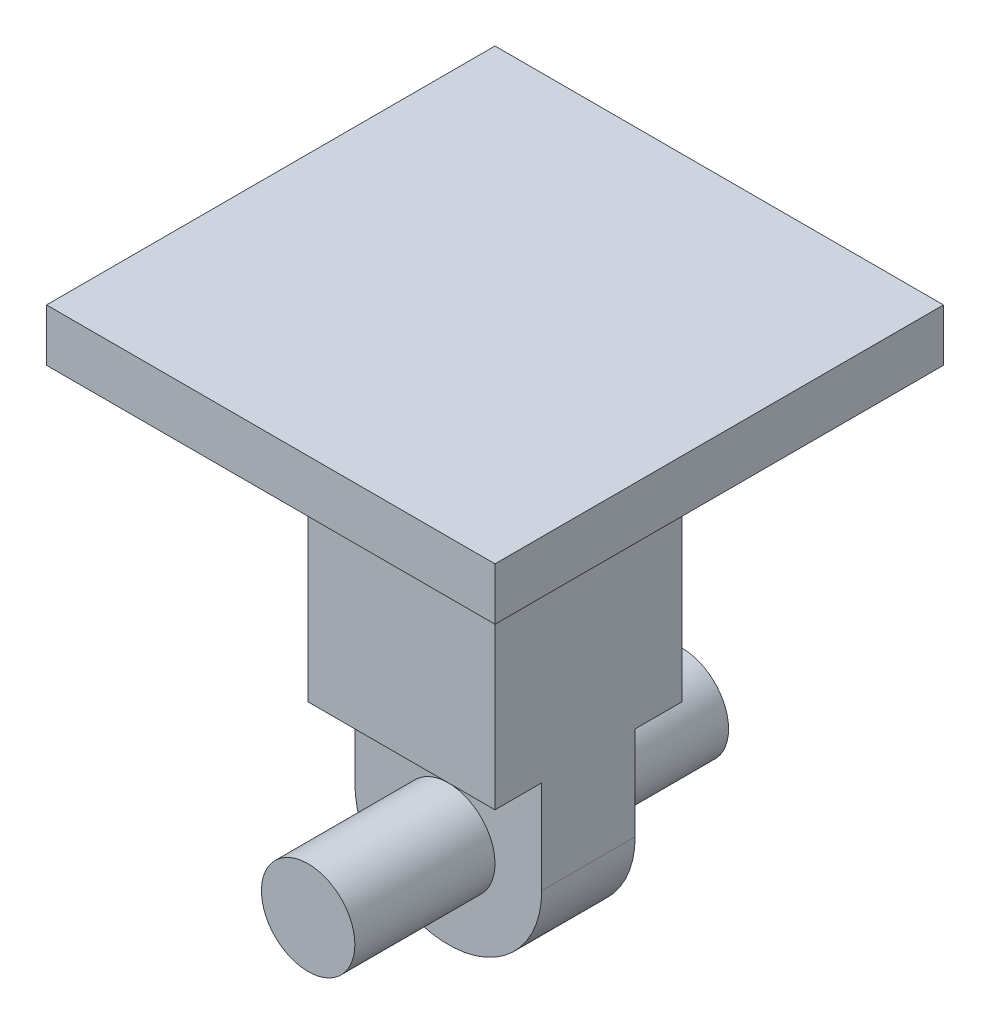
ISO-10303-21;
HEADER;
FILE_DESCRIPTION(('STEP AP214'),'2;1');
FILE_NAME('part.step','',(''),(''),'','','');
FILE_SCHEMA(('AUTOMOTIVE_DESIGN { 1 0 10303 214 1 1 1 1 }'));
ENDSEC;
DATA;
#1=APPLICATION_CONTEXT('core data for automotive mechanical design processes');
#2=APPLICATION_PROTOCOL_DEFINITION('international standard','automotive_design',2000,#1);
#3=PRODUCT_CONTEXT('',#1,'mechanical');
#4=PRODUCT('Part','Part','',(#3));
#5=PRODUCT_RELATED_PRODUCT_CATEGORY('part','',(#4));
#6=PRODUCT_DEFINITION_FORMATION('','',#4);
#7=PRODUCT_DEFINITION_CONTEXT('part definition',#1,'design');
#8=PRODUCT_DEFINITION('design','',#6,#7);
#9=PRODUCT_DEFINITION_SHAPE('','',#8);
#10=(LENGTH_UNIT() NAMED_UNIT(*) SI_UNIT(.MILLI.,.METRE.));
#11=(NAMED_UNIT(*) PLANE_ANGLE_UNIT() SI_UNIT($,.RADIAN.));
#12=(NAMED_UNIT(*) SI_UNIT($,.STERADIAN.) SOLID_ANGLE_UNIT());
#13=UNCERTAINTY_MEASURE_WITH_UNIT(LENGTH_MEASURE(1.E-05),#10,'distance_accuracy_value','');
#14=(GEOMETRIC_REPRESENTATION_CONTEXT(3) GLOBAL_UNCERTAINTY_ASSIGNED_CONTEXT((#13)) GLOBAL_UNIT_ASSIGNED_CONTEXT((#10,
#11,#12)) REPRESENTATION_CONTEXT('',''));
#15=CARTESIAN_POINT('',(0.,0.,0.));
#16=DIRECTION('',(0.,0.,1.));
#17=DIRECTION('',(1.,0.,0.));
#18=AXIS2_PLACEMENT_3D('',#15,#16,#17);
#19=CARTESIAN_POINT('',(12.5,-51.5,12.5));
#20=DIRECTION('',(1.,0.,0.));
#21=DIRECTION('',(0.,0.,-1.));
#22=AXIS2_PLACEMENT_3D('',#19,#20,#21);
#23=PLANE('',#22);
#24=DIRECTION('',(0.,0.,-1.));
#25=VECTOR('',#24,1.);
#26=CARTESIAN_POINT('',(12.5,-39.,12.5));
#27=LINE('',#26,#25);
#28=CARTESIAN_POINT('',(12.5,-39.,12.5));
#29=VERTEX_POINT('',#28);
#30=CARTESIAN_POINT('',(12.5,-39.,6.25));
#31=VERTEX_POINT('',#30);
#32=EDGE_CURVE('E129',#29,#31,#27,.T.);
#33=ORIENTED_EDGE('',*,*,#32,.T.);
#34=DIRECTION('',(0.,-1.,0.));
#35=VECTOR('',#34,1.);
#36=CARTESIAN_POINT('',(12.5,-39.,6.25));
#37=LINE('',#36,#35);
#38=CARTESIAN_POINT('',(12.5,-51.5,6.25));
#39=VERTEX_POINT('',#38);
#40=EDGE_CURVE('E197',#31,#39,#37,.T.);
#41=ORIENTED_EDGE('',*,*,#40,.T.);
#42=DIRECTION('',(0.,0.,-1.));
#43=VECTOR('',#42,1.);
#44=CARTESIAN_POINT('',(12.5,-51.5,12.5));
#45=LINE('',#44,#43);
#46=CARTESIAN_POINT('',(12.5,-51.5,-6.25000000000001));
#47=VERTEX_POINT('',#46);
#48=EDGE_CURVE('E191',#39,#47,#45,.T.);
#49=ORIENTED_EDGE('',*,*,#48,.T.);
#50=DIRECTION('',(0.,-1.,0.));
#51=VECTOR('',#50,1.);
#52=CARTESIAN_POINT('',(12.5,-39.,-6.25));
#53=LINE('',#52,#51);
#54=CARTESIAN_POINT('',(12.5,-39.,-6.25));
#55=VERTEX_POINT('',#54);
#56=EDGE_CURVE('E50',#55,#47,#53,.T.);
#57=ORIENTED_EDGE('',*,*,#56,.F.);
#58=DIRECTION('',(0.,0.,-1.));
#59=VECTOR('',#58,1.);
#60=CARTESIAN_POINT('',(12.5,-39.,-12.5));
#61=LINE('',#60,#59);
#62=CARTESIAN_POINT('',(12.5,-39.,-12.5));
#63=VERTEX_POINT('',#62);
#64=EDGE_CURVE('E223',#55,#63,#61,.T.);
#65=ORIENTED_EDGE('',*,*,#64,.T.);
#66=DIRECTION('',(0.,1.,0.));
#67=VECTOR('',#66,1.);
#68=CARTESIAN_POINT('',(12.5,-51.5,-12.5));
#69=LINE('',#68,#67);
#70=CARTESIAN_POINT('',(12.5,0.,-12.5));
#71=VERTEX_POINT('',#70);
#72=EDGE_CURVE('E151',#63,#71,#69,.T.);
#73=ORIENTED_EDGE('',*,*,#72,.T.);
#74=DIRECTION('',(0.,0.,-1.));
#75=VECTOR('',#74,1.);
#76=CARTESIAN_POINT('',(12.5,0.,12.5));
#77=LINE('',#76,#75);
#78=CARTESIAN_POINT('',(12.5,0.,12.5));
#79=VERTEX_POINT('',#78);
#80=EDGE_CURVE('E204',#79,#71,#77,.T.);
#81=ORIENTED_EDGE('',*,*,#80,.F.);
#82=DIRECTION('',(0.,1.,0.));
#83=VECTOR('',#82,1.);
#84=CARTESIAN_POINT('',(12.5,-51.5,12.5));
#85=LINE('',#84,#83);
#86=EDGE_CURVE('E146',#29,#79,#85,.T.);
#87=ORIENTED_EDGE('',*,*,#86,.F.);
#88=EDGE_LOOP('',(#33,#41,#49,#57,#65,#73,#81,#87));
#89=FACE_BOUND('',#88,.T.);
#90=ADVANCED_FACE('F34',(#89),#23,.T.);
#91=CARTESIAN_POINT('',(-12.5,-51.5,12.5));
#92=DIRECTION('',(0.,0.,1.));
#93=DIRECTION('',(1.,0.,0.));
#94=AXIS2_PLACEMENT_3D('',#91,#92,#93);
#95=PLANE('',#94);
#96=DIRECTION('',(0.,1.,0.));
#97=VECTOR('',#96,1.);
#98=CARTESIAN_POINT('',(-12.5,-51.5,12.5));
#99=LINE('',#98,#97);
#100=CARTESIAN_POINT('',(-12.5,-39.,12.5));
#101=VERTEX_POINT('',#100);
#102=CARTESIAN_POINT('',(-12.5,0.,12.5));
#103=VERTEX_POINT('',#102);
#104=EDGE_CURVE('E138',#101,#103,#99,.T.);
#105=ORIENTED_EDGE('',*,*,#104,.F.);
#106=DIRECTION('',(1.,0.,0.));
#107=VECTOR('',#106,1.);
#108=CARTESIAN_POINT('',(-12.5,-39.,12.5));
#109=LINE('',#108,#107);
#110=EDGE_CURVE('E123',#101,#29,#109,.T.);
#111=ORIENTED_EDGE('',*,*,#110,.T.);
#112=ORIENTED_EDGE('',*,*,#86,.T.);
#113=DIRECTION('',(1.,0.,0.));
#114=VECTOR('',#113,1.);
#115=CARTESIAN_POINT('',(-12.5,0.,12.5));
#116=LINE('',#115,#114);
#117=EDGE_CURVE('E144',#103,#79,#116,.T.);
#118=ORIENTED_EDGE('',*,*,#117,.F.);
#119=EDGE_LOOP('',(#105,#111,#112,#118));
#120=FACE_BOUND('',#119,.T.);
#121=ADVANCED_FACE('F142',(#120),#95,.T.);
#122=CARTESIAN_POINT('',(-12.5,-51.5,12.5));
#123=DIRECTION('',(-1.,0.,0.));
#124=DIRECTION('',(0.,0.,1.));
#125=AXIS2_PLACEMENT_3D('',#122,#123,#124);
#126=PLANE('',#125);
#127=DIRECTION('',(0.,0.,1.));
#128=VECTOR('',#127,1.);
#129=CARTESIAN_POINT('',(-12.5,-51.5,12.5));
#130=LINE('',#129,#128);
#131=CARTESIAN_POINT('',(-12.5,-51.5,-6.25));
#132=VERTEX_POINT('',#131);
#133=CARTESIAN_POINT('',(-12.5,-51.5,6.25));
#134=VERTEX_POINT('',#133);
#135=EDGE_CURVE('E156',#132,#134,#130,.T.);
#136=ORIENTED_EDGE('',*,*,#135,.T.);
#137=DIRECTION('',(0.,-1.,0.));
#138=VECTOR('',#137,1.);
#139=CARTESIAN_POINT('',(-12.5,-39.,6.25));
#140=LINE('',#139,#138);
#141=CARTESIAN_POINT('',(-12.5,-39.,6.25));
#142=VERTEX_POINT('',#141);
#143=EDGE_CURVE('E58',#142,#134,#140,.T.);
#144=ORIENTED_EDGE('',*,*,#143,.F.);
#145=DIRECTION('',(0.,0.,1.));
#146=VECTOR('',#145,1.);
#147=CARTESIAN_POINT('',(-12.5,-39.,12.5));
#148=LINE('',#147,#146);
#149=EDGE_CURVE('E127',#142,#101,#148,.T.);
#150=ORIENTED_EDGE('',*,*,#149,.T.);
#151=ORIENTED_EDGE('',*,*,#104,.T.);
#152=DIRECTION('',(0.,0.,1.));
#153=VECTOR('',#152,1.);
#154=CARTESIAN_POINT('',(-12.5,0.,12.5));
#155=LINE('',#154,#153);
#156=CARTESIAN_POINT('',(-12.5,0.,-12.5));
#157=VERTEX_POINT('',#156);
#158=EDGE_CURVE('E200',#157,#103,#155,.T.);
#159=ORIENTED_EDGE('',*,*,#158,.F.);
#160=DIRECTION('',(0.,1.,0.));
#161=VECTOR('',#160,1.);
#162=CARTESIAN_POINT('',(-12.5,-51.5,-12.5));
#163=LINE('',#162,#161);
#164=CARTESIAN_POINT('',(-12.5,-39.,-12.5));
#165=VERTEX_POINT('',#164);
#166=EDGE_CURVE('E147',#165,#157,#163,.T.);
#167=ORIENTED_EDGE('',*,*,#166,.F.);
#168=DIRECTION('',(0.,0.,1.));
#169=VECTOR('',#168,1.);
#170=CARTESIAN_POINT('',(-12.5,-39.,-12.5));
#171=LINE('',#170,#169);
#172=CARTESIAN_POINT('',(-12.5,-39.,-6.25));
#173=VERTEX_POINT('',#172);
#174=EDGE_CURVE('E215',#165,#173,#171,.T.);
#175=ORIENTED_EDGE('',*,*,#174,.T.);
#176=DIRECTION('',(0.,-1.,0.));
#177=VECTOR('',#176,1.);
#178=CARTESIAN_POINT('',(-12.5,-39.,-6.25));
#179=LINE('',#178,#177);
#180=EDGE_CURVE('E140',#173,#132,#179,.T.);
#181=ORIENTED_EDGE('',*,*,#180,.T.);
#182=EDGE_LOOP('',(#136,#144,#150,#151,#159,#167,#175,#181));
#183=FACE_BOUND('',#182,.T.);
#184=ADVANCED_FACE('F136',(#183),#126,.T.);
#185=CARTESIAN_POINT('',(0.,-51.5,-40.4508497187474));
#186=DIRECTION('',(0.,0.,1.));
#187=DIRECTION('',(1.,0.,0.));
#188=AXIS2_PLACEMENT_3D('',#185,#186,#187);
#189=CYLINDRICAL_SURFACE('',#188,12.5);
#190=ORIENTED_EDGE('',*,*,#48,.F.);
#191=CARTESIAN_POINT('',(0.,-51.5,6.25));
#192=DIRECTION('',(0.,0.,1.));
#193=DIRECTION('',(1.,0.,0.));
#194=AXIS2_PLACEMENT_3D('',#191,#192,#193);
#195=CIRCLE('',#194,12.5);
#196=EDGE_CURVE('E11',#39,#134,#195,.F.);
#197=ORIENTED_EDGE('',*,*,#196,.T.);
#198=ORIENTED_EDGE('',*,*,#135,.F.);
#199=CARTESIAN_POINT('',(0.,-51.5,-6.25));
#200=DIRECTION('',(0.,0.,-1.));
#201=DIRECTION('',(-1.,0.,0.));
#202=AXIS2_PLACEMENT_3D('',#199,#200,#201);
#203=CIRCLE('',#202,12.5);
#204=EDGE_CURVE('E43',#132,#47,#203,.F.);
#205=ORIENTED_EDGE('',*,*,#204,.T.);
#206=EDGE_LOOP('',(#190,#197,#198,#205));
#207=FACE_BOUND('',#206,.T.);
#208=ADVANCED_FACE('F190',(#207),#189,.T.);
#209=CARTESIAN_POINT('',(0.,0.,0.));
#210=DIRECTION('',(0.,-1.,0.));
#211=DIRECTION('',(0.,0.,-1.));
#212=AXIS2_PLACEMENT_3D('',#209,#210,#211);
#213=PLANE('',#212);
#214=DIRECTION('',(0.,0.,-1.));
#215=VECTOR('',#214,1.);
#216=CARTESIAN_POINT('',(30.,0.,30.));
#217=LINE('',#216,#215);
#218=CARTESIAN_POINT('',(30.,0.,30.));
#219=VERTEX_POINT('',#218);
#220=CARTESIAN_POINT('',(30.,0.,-30.));
#221=VERTEX_POINT('',#220);
#222=EDGE_CURVE('E149',#219,#221,#217,.T.);
#223=ORIENTED_EDGE('',*,*,#222,.F.);
#224=DIRECTION('',(1.,0.,0.));
#225=VECTOR('',#224,1.);
#226=CARTESIAN_POINT('',(-30.,0.,30.));
#227=LINE('',#226,#225);
#228=CARTESIAN_POINT('',(-30.,0.,30.));
#229=VERTEX_POINT('',#228);
#230=EDGE_CURVE('E161',#229,#219,#227,.T.);
#231=ORIENTED_EDGE('',*,*,#230,.F.);
#232=DIRECTION('',(0.,0.,1.));
#233=VECTOR('',#232,1.);
#234=CARTESIAN_POINT('',(-30.,0.,30.));
#235=LINE('',#234,#233);
#236=CARTESIAN_POINT('',(-30.,0.,-30.));
#237=VERTEX_POINT('',#236);
#238=EDGE_CURVE('E172',#237,#229,#235,.T.);
#239=ORIENTED_EDGE('',*,*,#238,.F.);
#240=DIRECTION('',(-1.,0.,0.));
#241=VECTOR('',#240,1.);
#242=CARTESIAN_POINT('',(-30.,0.,-30.));
#243=LINE('',#242,#241);
#244=EDGE_CURVE('E170',#221,#237,#243,.T.);
#245=ORIENTED_EDGE('',*,*,#244,.F.);
#246=EDGE_LOOP('',(#223,#231,#239,#245));
#247=FACE_BOUND('',#246,.T.);
#248=ORIENTED_EDGE('',*,*,#117,.T.);
#249=ORIENTED_EDGE('',*,*,#80,.T.);
#250=DIRECTION('',(-1.,0.,0.));
#251=VECTOR('',#250,1.);
#252=CARTESIAN_POINT('',(-12.5,0.,-12.5));
#253=LINE('',#252,#251);
#254=EDGE_CURVE('E207',#71,#157,#253,.T.);
#255=ORIENTED_EDGE('',*,*,#254,.T.);
#256=ORIENTED_EDGE('',*,*,#158,.T.);
#257=EDGE_LOOP('',(#248,#249,#255,#256));
#258=FACE_BOUND('',#257,.T.);
#259=ADVANCED_FACE('F211',(#247,#258),#213,.T.);
#260=CARTESIAN_POINT('',(30.,7.,30.));
#261=DIRECTION('',(-1.,0.,0.));
#262=DIRECTION('',(0.,0.,1.));
#263=AXIS2_PLACEMENT_3D('',#260,#261,#262);
#264=PLANE('',#263);
#265=ORIENTED_EDGE('',*,*,#222,.T.);
#266=DIRECTION('',(0.,-1.,0.));
#267=VECTOR('',#266,1.);
#268=CARTESIAN_POINT('',(30.,7.,-30.));
#269=LINE('',#268,#267);
#270=CARTESIAN_POINT('',(30.,7.,-30.));
#271=VERTEX_POINT('',#270);
#272=EDGE_CURVE('E183',#271,#221,#269,.T.);
#273=ORIENTED_EDGE('',*,*,#272,.F.);
#274=DIRECTION('',(0.,0.,-1.));
#275=VECTOR('',#274,1.);
#276=CARTESIAN_POINT('',(30.,7.,30.));
#277=LINE('',#276,#275);
#278=CARTESIAN_POINT('',(30.,7.,30.));
#279=VERTEX_POINT('',#278);
#280=EDGE_CURVE('E157',#279,#271,#277,.T.);
#281=ORIENTED_EDGE('',*,*,#280,.F.);
#282=DIRECTION('',(0.,-1.,0.));
#283=VECTOR('',#282,1.);
#284=CARTESIAN_POINT('',(30.,7.,30.));
#285=LINE('',#284,#283);
#286=EDGE_CURVE('E167',#279,#219,#285,.T.);
#287=ORIENTED_EDGE('',*,*,#286,.T.);
#288=EDGE_LOOP('',(#265,#273,#281,#287));
#289=FACE_BOUND('',#288,.T.);
#290=ADVANCED_FACE('F36',(#289),#264,.F.);
#291=CARTESIAN_POINT('',(-30.,7.,-30.));
#292=DIRECTION('',(0.,0.,1.));
#293=DIRECTION('',(1.,0.,0.));
#294=AXIS2_PLACEMENT_3D('',#291,#292,#293);
#295=PLANE('',#294);
#296=ORIENTED_EDGE('',*,*,#244,.T.);
#297=DIRECTION('',(0.,-1.,0.));
#298=VECTOR('',#297,1.);
#299=CARTESIAN_POINT('',(-30.,7.,-30.));
#300=LINE('',#299,#298);
#301=CARTESIAN_POINT('',(-30.,7.,-30.));
#302=VERTEX_POINT('',#301);
#303=EDGE_CURVE('E180',#302,#237,#300,.T.);
#304=ORIENTED_EDGE('',*,*,#303,.F.);
#305=DIRECTION('',(-1.,0.,0.));
#306=VECTOR('',#305,1.);
#307=CARTESIAN_POINT('',(-30.,7.,-30.));
#308=LINE('',#307,#306);
#309=EDGE_CURVE('E160',#271,#302,#308,.T.);
#310=ORIENTED_EDGE('',*,*,#309,.F.);
#311=ORIENTED_EDGE('',*,*,#272,.T.);
#312=EDGE_LOOP('',(#296,#304,#310,#311));
#313=FACE_BOUND('',#312,.T.);
#314=ADVANCED_FACE('F279',(#313),#295,.F.);
#315=CARTESIAN_POINT('',(-30.,7.,30.));
#316=DIRECTION('',(1.,0.,0.));
#317=DIRECTION('',(0.,0.,-1.));
#318=AXIS2_PLACEMENT_3D('',#315,#316,#317);
#319=PLANE('',#318);
#320=ORIENTED_EDGE('',*,*,#238,.T.);
#321=DIRECTION('',(0.,-1.,0.));
#322=VECTOR('',#321,1.);
#323=CARTESIAN_POINT('',(-30.,7.,30.));
#324=LINE('',#323,#322);
#325=CARTESIAN_POINT('',(-30.,7.,30.));
#326=VERTEX_POINT('',#325);
#327=EDGE_CURVE('E177',#326,#229,#324,.T.);
#328=ORIENTED_EDGE('',*,*,#327,.F.);
#329=DIRECTION('',(0.,0.,1.));
#330=VECTOR('',#329,1.);
#331=CARTESIAN_POINT('',(-30.,7.,30.));
#332=LINE('',#331,#330);
#333=EDGE_CURVE('E163',#302,#326,#332,.T.);
#334=ORIENTED_EDGE('',*,*,#333,.F.);
#335=ORIENTED_EDGE('',*,*,#303,.T.);
#336=EDGE_LOOP('',(#320,#328,#334,#335));
#337=FACE_BOUND('',#336,.T.);
#338=ADVANCED_FACE('F276',(#337),#319,.F.);
#339=CARTESIAN_POINT('',(-30.,7.,30.));
#340=DIRECTION('',(0.,0.,-1.));
#341=DIRECTION('',(-1.,0.,0.));
#342=AXIS2_PLACEMENT_3D('',#339,#340,#341);
#343=PLANE('',#342);
#344=ORIENTED_EDGE('',*,*,#230,.T.);
#345=ORIENTED_EDGE('',*,*,#286,.F.);
#346=DIRECTION('',(1.,0.,0.));
#347=VECTOR('',#346,1.);
#348=CARTESIAN_POINT('',(-30.,7.,30.));
#349=LINE('',#348,#347);
#350=EDGE_CURVE('E165',#326,#279,#349,.T.);
#351=ORIENTED_EDGE('',*,*,#350,.F.);
#352=ORIENTED_EDGE('',*,*,#327,.T.);
#353=EDGE_LOOP('',(#344,#345,#351,#352));
#354=FACE_BOUND('',#353,.T.);
#355=ADVANCED_FACE('F269',(#354),#343,.F.);
#356=CARTESIAN_POINT('',(0.,7.,0.));
#357=DIRECTION('',(0.,-1.,0.));
#358=DIRECTION('',(0.,0.,-1.));
#359=AXIS2_PLACEMENT_3D('',#356,#357,#358);
#360=PLANE('',#359);
#361=ORIENTED_EDGE('',*,*,#280,.T.);
#362=ORIENTED_EDGE('',*,*,#309,.T.);
#363=ORIENTED_EDGE('',*,*,#333,.T.);
#364=ORIENTED_EDGE('',*,*,#350,.T.);
#365=EDGE_LOOP('',(#361,#362,#363,#364));
#366=FACE_BOUND('',#365,.T.);
#367=ADVANCED_FACE('F266',(#366),#360,.F.);
#368=CARTESIAN_POINT('',(-12.5,-51.5,-12.5));
#369=DIRECTION('',(0.,0.,-1.));
#370=DIRECTION('',(-1.,0.,0.));
#371=AXIS2_PLACEMENT_3D('',#368,#369,#370);
#372=PLANE('',#371);
#373=DIRECTION('',(-1.,0.,0.));
#374=VECTOR('',#373,1.);
#375=CARTESIAN_POINT('',(-12.5,-39.,-12.5));
#376=LINE('',#375,#374);
#377=EDGE_CURVE('E220',#63,#165,#376,.T.);
#378=ORIENTED_EDGE('',*,*,#377,.T.);
#379=ORIENTED_EDGE('',*,*,#166,.T.);
#380=ORIENTED_EDGE('',*,*,#254,.F.);
#381=ORIENTED_EDGE('',*,*,#72,.F.);
#382=EDGE_LOOP('',(#378,#379,#380,#381));
#383=FACE_BOUND('',#382,.T.);
#384=ADVANCED_FACE('F218',(#383),#372,.T.);
#385=CARTESIAN_POINT('',(-12.5,-39.,-6.25));
#386=DIRECTION('',(0.,0.,-1.));
#387=DIRECTION('',(-1.,0.,0.));
#388=AXIS2_PLACEMENT_3D('',#385,#386,#387);
#389=PLANE('',#388);
#390=CARTESIAN_POINT('',(0.,-51.5,-6.25));
#391=DIRECTION('',(0.,0.,-1.));
#392=DIRECTION('',(-1.,0.,0.));
#393=AXIS2_PLACEMENT_3D('',#390,#391,#392);
#394=CIRCLE('',#393,6.25);
#395=CARTESIAN_POINT('',(-6.25,-51.5,-6.25));
#396=VERTEX_POINT('',#395);
#397=EDGE_CURVE('E230',#396,#396,#394,.F.);
#398=ORIENTED_EDGE('',*,*,#397,.T.);
#399=EDGE_LOOP('',(#398));
#400=FACE_BOUND('',#399,.T.);
#401=ORIENTED_EDGE('',*,*,#180,.F.);
#402=DIRECTION('',(1.,0.,0.));
#403=VECTOR('',#402,1.);
#404=CARTESIAN_POINT('',(-12.5,-39.,-6.25));
#405=LINE('',#404,#403);
#406=EDGE_CURVE('E225',#173,#55,#405,.T.);
#407=ORIENTED_EDGE('',*,*,#406,.T.);
#408=ORIENTED_EDGE('',*,*,#56,.T.);
#409=ORIENTED_EDGE('',*,*,#204,.F.);
#410=EDGE_LOOP('',(#401,#407,#408,#409));
#411=FACE_BOUND('',#410,.T.);
#412=ADVANCED_FACE('F330',(#400,#411),#389,.T.);
#413=CARTESIAN_POINT('',(0.,-39.,0.));
#414=DIRECTION('',(0.,1.,0.));
#415=DIRECTION('',(0.,0.,1.));
#416=AXIS2_PLACEMENT_3D('',#413,#414,#415);
#417=PLANE('',#416);
#418=ORIENTED_EDGE('',*,*,#174,.F.);
#419=ORIENTED_EDGE('',*,*,#377,.F.);
#420=ORIENTED_EDGE('',*,*,#64,.F.);
#421=ORIENTED_EDGE('',*,*,#406,.F.);
#422=EDGE_LOOP('',(#418,#419,#420,#421));
#423=FACE_BOUND('',#422,.T.);
#424=ADVANCED_FACE('F336',(#423),#417,.F.);
#425=CARTESIAN_POINT('',(-12.5,-39.,6.25));
#426=DIRECTION('',(0.,0.,1.));
#427=DIRECTION('',(1.,0.,0.));
#428=AXIS2_PLACEMENT_3D('',#425,#426,#427);
#429=PLANE('',#428);
#430=CARTESIAN_POINT('',(0.,-51.5,6.25));
#431=DIRECTION('',(0.,0.,1.));
#432=DIRECTION('',(1.,0.,0.));
#433=AXIS2_PLACEMENT_3D('',#430,#431,#432);
#434=CIRCLE('',#433,6.25);
#435=CARTESIAN_POINT('',(6.25,-51.5,6.25));
#436=VERTEX_POINT('',#435);
#437=EDGE_CURVE('E38',#436,#436,#434,.F.);
#438=ORIENTED_EDGE('',*,*,#437,.T.);
#439=EDGE_LOOP('',(#438));
#440=FACE_BOUND('',#439,.T.);
#441=ORIENTED_EDGE('',*,*,#40,.F.);
#442=DIRECTION('',(-1.,0.,0.));
#443=VECTOR('',#442,1.);
#444=CARTESIAN_POINT('',(-12.5,-39.,6.25));
#445=LINE('',#444,#443);
#446=EDGE_CURVE('E233',#31,#142,#445,.T.);
#447=ORIENTED_EDGE('',*,*,#446,.T.);
#448=ORIENTED_EDGE('',*,*,#143,.T.);
#449=ORIENTED_EDGE('',*,*,#196,.F.);
#450=EDGE_LOOP('',(#441,#447,#448,#449));
#451=FACE_BOUND('',#450,.T.);
#452=ADVANCED_FACE('F347',(#440,#451),#429,.T.);
#453=CARTESIAN_POINT('',(0.,-39.,0.));
#454=DIRECTION('',(0.,-1.,0.));
#455=DIRECTION('',(0.,0.,-1.));
#456=AXIS2_PLACEMENT_3D('',#453,#454,#455);
#457=PLANE('',#456);
#458=ORIENTED_EDGE('',*,*,#149,.F.);
#459=ORIENTED_EDGE('',*,*,#446,.F.);
#460=ORIENTED_EDGE('',*,*,#32,.F.);
#461=ORIENTED_EDGE('',*,*,#110,.F.);
#462=EDGE_LOOP('',(#458,#459,#460,#461));
#463=FACE_BOUND('',#462,.T.);
#464=ADVANCED_FACE('F125',(#463),#457,.T.);
#465=CARTESIAN_POINT('',(0.,-51.5,25.));
#466=DIRECTION('',(0.,0.,1.));
#467=DIRECTION('',(1.,0.,0.));
#468=AXIS2_PLACEMENT_3D('',#465,#466,#467);
#469=PLANE('',#468);
#470=CARTESIAN_POINT('',(0.,-51.5,25.));
#471=DIRECTION('',(0.,0.,1.));
#472=DIRECTION('',(1.,0.,0.));
#473=AXIS2_PLACEMENT_3D('',#470,#471,#472);
#474=CIRCLE('',#473,6.25);
#475=CARTESIAN_POINT('',(6.25,-51.5,25.));
#476=VERTEX_POINT('',#475);
#477=EDGE_CURVE('E238',#476,#476,#474,.T.);
#478=ORIENTED_EDGE('',*,*,#477,.T.);
#479=EDGE_LOOP('',(#478));
#480=FACE_BOUND('',#479,.T.);
#481=ADVANCED_FACE('F362',(#480),#469,.T.);
#482=CARTESIAN_POINT('',(0.,-51.5,25.));
#483=DIRECTION('',(0.,0.,-1.));
#484=DIRECTION('',(-1.,0.,0.));
#485=AXIS2_PLACEMENT_3D('',#482,#483,#484);
#486=CYLINDRICAL_SURFACE('',#485,6.25);
#487=ORIENTED_EDGE('',*,*,#437,.F.);
#488=EDGE_LOOP('',(#487));
#489=FACE_BOUND('',#488,.T.);
#490=ORIENTED_EDGE('',*,*,#477,.F.);
#491=EDGE_LOOP('',(#490));
#492=FACE_BOUND('',#491,.T.);
#493=ADVANCED_FACE('F253',(#489,#492),#486,.T.);
#494=ORIENTED_EDGE('',*,*,#397,.F.);
#495=EDGE_LOOP('',(#494));
#496=FACE_BOUND('',#495,.T.);
#497=CARTESIAN_POINT('',(0.,-51.5,-25.));
#498=DIRECTION('',(0.,0.,1.));
#499=DIRECTION('',(1.,0.,0.));
#500=AXIS2_PLACEMENT_3D('',#497,#498,#499);
#501=CIRCLE('',#500,6.25);
#502=CARTESIAN_POINT('',(6.25,-51.5,-25.));
#503=VERTEX_POINT('',#502);
#504=EDGE_CURVE('E241',#503,#503,#501,.T.);
#505=ORIENTED_EDGE('',*,*,#504,.T.);
#506=EDGE_LOOP('',(#505));
#507=FACE_BOUND('',#506,.T.);
#508=ADVANCED_FACE('F245',(#496,#507),#486,.T.);
#509=CARTESIAN_POINT('',(0.,-51.5,-25.));
#510=DIRECTION('',(0.,0.,1.));
#511=DIRECTION('',(1.,0.,0.));
#512=AXIS2_PLACEMENT_3D('',#509,#510,#511);
#513=PLANE('',#512);
#514=ORIENTED_EDGE('',*,*,#504,.F.);
#515=EDGE_LOOP('',(#514));
#516=FACE_BOUND('',#515,.T.);
#517=ADVANCED_FACE('F247',(#516),#513,.F.);
#518=CLOSED_SHELL('',(#90,#121,#184,#208,#259,#290,#314,#338,#355,#367,#384,#412,#424,#452,#464,
#481,#493,#508,#517));
#519=MANIFOLD_SOLID_BREP('B2',#518);
#520=ADVANCED_BREP_SHAPE_REPRESENTATION('',(#18,#519),#14);
#521=SHAPE_DEFINITION_REPRESENTATION(#9,#520);
ENDSEC;
END-ISO-10303-21;
